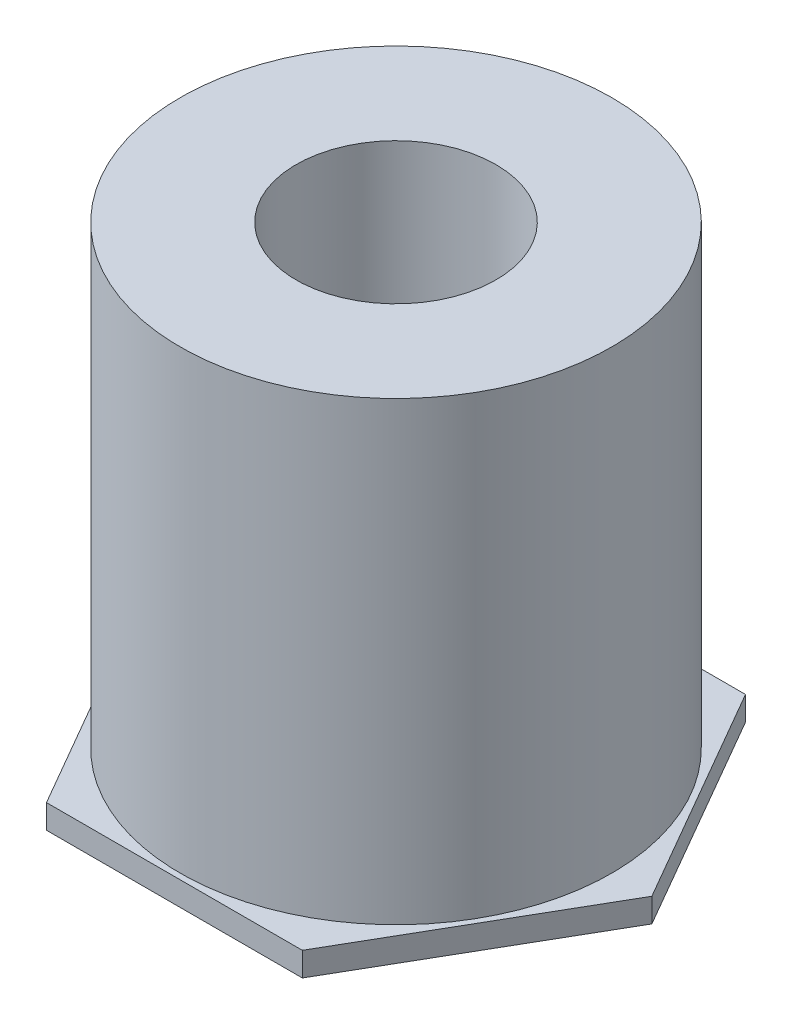
ISO-10303-21;
HEADER;
FILE_DESCRIPTION(('STEP AP214'),'2;1');
FILE_NAME('part.step','',(''),(''),'','','');
FILE_SCHEMA(('AUTOMOTIVE_DESIGN { 1 0 10303 214 1 1 1 1 }'));
ENDSEC;
DATA;
#1=APPLICATION_CONTEXT('core data for automotive mechanical design processes');
#2=APPLICATION_PROTOCOL_DEFINITION('international standard','automotive_design',2000,#1);
#3=PRODUCT_CONTEXT('',#1,'mechanical');
#4=PRODUCT('Part','Part','',(#3));
#5=PRODUCT_RELATED_PRODUCT_CATEGORY('part','',(#4));
#6=PRODUCT_DEFINITION_FORMATION('','',#4);
#7=PRODUCT_DEFINITION_CONTEXT('part definition',#1,'design');
#8=PRODUCT_DEFINITION('design','',#6,#7);
#9=PRODUCT_DEFINITION_SHAPE('','',#8);
#10=(LENGTH_UNIT() NAMED_UNIT(*) SI_UNIT(.MILLI.,.METRE.));
#11=(NAMED_UNIT(*) PLANE_ANGLE_UNIT() SI_UNIT($,.RADIAN.));
#12=(NAMED_UNIT(*) SI_UNIT($,.STERADIAN.) SOLID_ANGLE_UNIT());
#13=UNCERTAINTY_MEASURE_WITH_UNIT(LENGTH_MEASURE(1.E-05),#10,'distance_accuracy_value','');
#14=(GEOMETRIC_REPRESENTATION_CONTEXT(3) GLOBAL_UNCERTAINTY_ASSIGNED_CONTEXT((#13)) GLOBAL_UNIT_ASSIGNED_CONTEXT((#10,
#11,#12)) REPRESENTATION_CONTEXT('',''));
#15=CARTESIAN_POINT('',(0.,0.,0.));
#16=DIRECTION('',(0.,0.,1.));
#17=DIRECTION('',(1.,0.,0.));
#18=AXIS2_PLACEMENT_3D('',#15,#16,#17);
#19=CARTESIAN_POINT('',(22.,-2.,-43.5));
#20=DIRECTION('',(0.,-1.,0.));
#21=DIRECTION('',(0.,0.,-1.));
#22=AXIS2_PLACEMENT_3D('',#19,#20,#21);
#23=CYLINDRICAL_SURFACE('',#22,2.70000000000001);
#24=CARTESIAN_POINT('',(22.,-7.69999999999982,-43.5));
#25=DIRECTION('',(0.,-1.,0.));
#26=DIRECTION('',(0.,0.,-1.));
#27=AXIS2_PLACEMENT_3D('',#24,#25,#26);
#28=CIRCLE('',#27,2.70000000000001);
#29=CARTESIAN_POINT('',(22.,-7.69999999999982,-46.2));
#30=VERTEX_POINT('',#29);
#31=EDGE_CURVE('P0_E21',#30,#30,#28,.F.);
#32=ORIENTED_EDGE('',*,*,#31,.T.);
#33=EDGE_LOOP('',(#32));
#34=FACE_BOUND('',#33,.T.);
#35=CARTESIAN_POINT('',(22.,-2.,-43.5));
#36=DIRECTION('',(0.,-1.,0.));
#37=DIRECTION('',(0.,0.,-1.));
#38=AXIS2_PLACEMENT_3D('',#35,#36,#37);
#39=CIRCLE('',#38,2.70000000000001);
#40=CARTESIAN_POINT('',(22.,-2.,-46.2));
#41=VERTEX_POINT('',#40);
#42=EDGE_CURVE('P0_E83',#41,#41,#39,.T.);
#43=ORIENTED_EDGE('',*,*,#42,.T.);
#44=EDGE_LOOP('',(#43));
#45=FACE_BOUND('',#44,.T.);
#46=ADVANCED_FACE('P0_F17',(#34,#45),#23,.T.);
#47=CARTESIAN_POINT('',(25.328,-7.7,-46.38213254379));
#48=DIRECTION('',(0.,-1.,0.));
#49=DIRECTION('',(0.,0.,1.));
#50=AXIS2_PLACEMENT_3D('',#47,#48,#49);
#51=PLANE('',#50);
#52=ORIENTED_EDGE('',*,*,#31,.F.);
#53=EDGE_LOOP('',(#52));
#54=FACE_BOUND('',#53,.T.);
#55=DIRECTION('',(0.500000000000601,0.,0.866025403784092));
#56=VECTOR('',#55,1.);
#57=CARTESIAN_POINT('',(19.6,-7.70000000000009,-42.114359353945));
#58=LINE('',#57,#56);
#59=CARTESIAN_POINT('',(18.8000000001443,-7.70000000000005,-43.49999999975));
#60=VERTEX_POINT('',#59);
#61=CARTESIAN_POINT('',(20.4,-7.70000000000005,-40.7287187078929));
#62=VERTEX_POINT('',#61);
#63=EDGE_CURVE('P0_E96',#60,#62,#58,.T.);
#64=ORIENTED_EDGE('',*,*,#63,.T.);
#65=DIRECTION('',(1.,0.,0.));
#66=VECTOR('',#65,1.);
#67=CARTESIAN_POINT('',(22.,-7.70000000000009,-40.72871870789));
#68=LINE('',#67,#66);
#69=CARTESIAN_POINT('',(23.6,-7.70000000000005,-40.7287187078929));
#70=VERTEX_POINT('',#69);
#71=EDGE_CURVE('P0_E99',#62,#70,#68,.T.);
#72=ORIENTED_EDGE('',*,*,#71,.T.);
#73=DIRECTION('',(0.500000000000604,0.,-0.86602540378409));
#74=VECTOR('',#73,1.);
#75=CARTESIAN_POINT('',(24.4,-7.70000000000009,-42.114359353945));
#76=LINE('',#75,#74);
#77=CARTESIAN_POINT('',(25.1999999998557,-7.70000000000005,-43.50000000025));
#78=VERTEX_POINT('',#77);
#79=EDGE_CURVE('P0_E102',#70,#78,#76,.T.);
#80=ORIENTED_EDGE('',*,*,#79,.T.);
#81=DIRECTION('',(-0.500000000000601,0.,-0.866025403784092));
#82=VECTOR('',#81,1.);
#83=CARTESIAN_POINT('',(24.4,-7.70000000000009,-44.885640646055));
#84=LINE('',#83,#82);
#85=CARTESIAN_POINT('',(23.6,-7.70000000000005,-46.2712812921071));
#86=VERTEX_POINT('',#85);
#87=EDGE_CURVE('P0_E82',#78,#86,#84,.T.);
#88=ORIENTED_EDGE('',*,*,#87,.T.);
#89=DIRECTION('',(-1.,0.,0.));
#90=VECTOR('',#89,1.);
#91=CARTESIAN_POINT('',(22.,-7.70000000000009,-46.27128129211));
#92=LINE('',#91,#90);
#93=CARTESIAN_POINT('',(20.4,-7.70000000000007,-46.2712812921083));
#94=VERTEX_POINT('',#93);
#95=EDGE_CURVE('P0_E77',#86,#94,#92,.T.);
#96=ORIENTED_EDGE('',*,*,#95,.T.);
#97=DIRECTION('',(-0.500000000000599,0.,0.866025403784093));
#98=VECTOR('',#97,1.);
#99=CARTESIAN_POINT('',(19.6,-7.70000000000009,-44.885640646055));
#100=LINE('',#99,#98);
#101=EDGE_CURVE('P0_E80',#94,#60,#100,.T.);
#102=ORIENTED_EDGE('',*,*,#101,.T.);
#103=EDGE_LOOP('',(#64,#72,#80,#88,#96,#102));
#104=FACE_BOUND('',#103,.T.);
#105=ADVANCED_FACE('P0_F78',(#54,#104),#51,.F.);
#106=CARTESIAN_POINT('',(24.80993409406,-2.,-46.308));
#107=DIRECTION('',(0.,-1.,0.));
#108=DIRECTION('',(0.,0.,1.));
#109=AXIS2_PLACEMENT_3D('',#106,#107,#108);
#110=PLANE('',#109);
#111=CARTESIAN_POINT('',(22.,-2.,-43.5));
#112=DIRECTION('',(0.,-1.,0.));
#113=DIRECTION('',(0.,0.,-1.));
#114=AXIS2_PLACEMENT_3D('',#111,#112,#113);
#115=CIRCLE('',#114,1.25);
#116=CARTESIAN_POINT('',(22.,-2.,-44.75));
#117=VERTEX_POINT('',#116);
#118=EDGE_CURVE('P0_E93',#117,#117,#115,.F.);
#119=ORIENTED_EDGE('',*,*,#118,.F.);
#120=EDGE_LOOP('',(#119));
#121=FACE_BOUND('',#120,.T.);
#122=ORIENTED_EDGE('',*,*,#42,.F.);
#123=EDGE_LOOP('',(#122));
#124=FACE_BOUND('',#123,.T.);
#125=ADVANCED_FACE('P0_F132',(#121,#124),#110,.F.);
#126=CARTESIAN_POINT('',(23.664,-7.686969082918,-46.27128129211));
#127=DIRECTION('',(0.,0.,1.));
#128=DIRECTION('',(-1.,0.,0.));
#129=AXIS2_PLACEMENT_3D('',#126,#127,#128);
#130=PLANE('',#129);
#131=ORIENTED_EDGE('',*,*,#95,.F.);
#132=DIRECTION('',(0.,-1.,0.));
#133=VECTOR('',#132,1.);
#134=CARTESIAN_POINT('',(23.6,-7.85,-46.2712812921079));
#135=LINE('',#134,#133);
#136=CARTESIAN_POINT('',(23.5999999999997,-8.,-46.2712812921064));
#137=VERTEX_POINT('',#136);
#138=EDGE_CURVE('P0_E51',#86,#137,#135,.T.);
#139=ORIENTED_EDGE('',*,*,#138,.T.);
#140=DIRECTION('',(1.,0.,0.));
#141=VECTOR('',#140,1.);
#142=CARTESIAN_POINT('',(22.,-8.,-46.2712812921052));
#143=LINE('',#142,#141);
#144=CARTESIAN_POINT('',(20.4000000000003,-8.,-46.2712812921064));
#145=VERTEX_POINT('',#144);
#146=EDGE_CURVE('P0_E57',#145,#137,#143,.T.);
#147=ORIENTED_EDGE('',*,*,#146,.F.);
#148=DIRECTION('',(0.,1.,0.));
#149=VECTOR('',#148,1.);
#150=CARTESIAN_POINT('',(20.4,-7.85,-46.2712812921079));
#151=LINE('',#150,#149);
#152=EDGE_CURVE('P0_E85',#145,#94,#151,.T.);
#153=ORIENTED_EDGE('',*,*,#152,.T.);
#154=EDGE_LOOP('',(#131,#139,#147,#153));
#155=FACE_BOUND('',#154,.T.);
#156=ADVANCED_FACE('P0_F86',(#155),#130,.F.);
#157=CARTESIAN_POINT('',(25.232,-7.686969082918,-43.44457437416));
#158=DIRECTION('',(-0.866025403784092,0.,0.5000000000006));
#159=DIRECTION('',(-0.5000000000006,0.,-0.866025403784092));
#160=AXIS2_PLACEMENT_3D('',#157,#158,#159);
#161=PLANE('',#160);
#162=ORIENTED_EDGE('',*,*,#87,.F.);
#163=DIRECTION('',(0.,-1.,0.));
#164=VECTOR('',#163,1.);
#165=CARTESIAN_POINT('',(25.2,-7.85,-43.4999999999979));
#166=LINE('',#165,#164);
#167=CARTESIAN_POINT('',(25.2000000000002,-8.,-43.4999999999991));
#168=VERTEX_POINT('',#167);
#169=EDGE_CURVE('P0_E101',#78,#168,#166,.T.);
#170=ORIENTED_EDGE('',*,*,#169,.T.);
#171=DIRECTION('',(0.500000000000678,0.,0.866025403784047));
#172=VECTOR('',#171,1.);
#173=CARTESIAN_POINT('',(23.6,-8.,-46.2712812921052));
#174=LINE('',#173,#172);
#175=EDGE_CURVE('P0_E111',#137,#168,#174,.T.);
#176=ORIENTED_EDGE('',*,*,#175,.F.);
#177=ORIENTED_EDGE('',*,*,#138,.F.);
#178=EDGE_LOOP('',(#162,#170,#176,#177));
#179=FACE_BOUND('',#178,.T.);
#180=ADVANCED_FACE('P0_F165',(#179),#161,.F.);
#181=CARTESIAN_POINT('',(23.568,-7.686969082918,-40.67329308205));
#182=DIRECTION('',(-0.866025403784091,0.,-0.500000000000602));
#183=DIRECTION('',(0.500000000000602,0.,-0.866025403784091));
#184=AXIS2_PLACEMENT_3D('',#181,#182,#183);
#185=PLANE('',#184);
#186=ORIENTED_EDGE('',*,*,#79,.F.);
#187=DIRECTION('',(0.,-1.,0.));
#188=VECTOR('',#187,1.);
#189=CARTESIAN_POINT('',(23.6,-7.85,-40.72871870789));
#190=LINE('',#189,#188);
#191=CARTESIAN_POINT('',(23.5999999999995,-8.,-40.7287187078927));
#192=VERTEX_POINT('',#191);
#193=EDGE_CURVE('P0_E98',#70,#192,#190,.T.);
#194=ORIENTED_EDGE('',*,*,#193,.T.);
#195=DIRECTION('',(-0.500000000000679,0.,0.866025403784047));
#196=VECTOR('',#195,1.);
#197=CARTESIAN_POINT('',(25.2,-8.,-43.5));
#198=LINE('',#197,#196);
#199=EDGE_CURVE('P0_E109',#168,#192,#198,.T.);
#200=ORIENTED_EDGE('',*,*,#199,.F.);
#201=ORIENTED_EDGE('',*,*,#169,.F.);
#202=EDGE_LOOP('',(#186,#194,#200,#201));
#203=FACE_BOUND('',#202,.T.);
#204=ADVANCED_FACE('P0_F162',(#203),#185,.F.);
#205=CARTESIAN_POINT('',(20.336,-7.686969082918,-40.72871870789));
#206=DIRECTION('',(0.,0.,-1.));
#207=DIRECTION('',(1.,0.,0.));
#208=AXIS2_PLACEMENT_3D('',#205,#206,#207);
#209=PLANE('',#208);
#210=ORIENTED_EDGE('',*,*,#71,.F.);
#211=DIRECTION('',(0.,-1.,0.));
#212=VECTOR('',#211,1.);
#213=CARTESIAN_POINT('',(20.4,-7.85,-40.7287187078921));
#214=LINE('',#213,#212);
#215=CARTESIAN_POINT('',(20.4000000000003,-8.,-40.7287187078936));
#216=VERTEX_POINT('',#215);
#217=EDGE_CURVE('P0_E89',#62,#216,#214,.T.);
#218=ORIENTED_EDGE('',*,*,#217,.T.);
#219=DIRECTION('',(-1.,0.,0.));
#220=VECTOR('',#219,1.);
#221=CARTESIAN_POINT('',(22.,-8.,-40.7287187078948));
#222=LINE('',#221,#220);
#223=EDGE_CURVE('P0_E106',#192,#216,#222,.T.);
#224=ORIENTED_EDGE('',*,*,#223,.F.);
#225=ORIENTED_EDGE('',*,*,#193,.F.);
#226=EDGE_LOOP('',(#210,#218,#224,#225));
#227=FACE_BOUND('',#226,.T.);
#228=ADVANCED_FACE('P0_F157',(#227),#209,.F.);
#229=CARTESIAN_POINT('',(18.768,-7.686969082918,-43.55542562584));
#230=DIRECTION('',(0.866025403784091,0.,-0.500000000000601));
#231=DIRECTION('',(0.500000000000601,0.,0.866025403784091));
#232=AXIS2_PLACEMENT_3D('',#229,#230,#231);
#233=PLANE('',#232);
#234=ORIENTED_EDGE('',*,*,#63,.F.);
#235=DIRECTION('',(0.,-1.,0.));
#236=VECTOR('',#235,1.);
#237=CARTESIAN_POINT('',(18.8,-7.85,-43.5000000000021));
#238=LINE('',#237,#236);
#239=CARTESIAN_POINT('',(18.8000000000002,-8.,-43.5000000000009));
#240=VERTEX_POINT('',#239);
#241=EDGE_CURVE('P0_E36',#60,#240,#238,.T.);
#242=ORIENTED_EDGE('',*,*,#241,.T.);
#243=DIRECTION('',(-0.500000000000679,0.,-0.866025403784047));
#244=VECTOR('',#243,1.);
#245=CARTESIAN_POINT('',(20.4,-8.,-40.7287187078948));
#246=LINE('',#245,#244);
#247=EDGE_CURVE('P0_E108',#216,#240,#246,.T.);
#248=ORIENTED_EDGE('',*,*,#247,.F.);
#249=ORIENTED_EDGE('',*,*,#217,.F.);
#250=EDGE_LOOP('',(#234,#242,#248,#249));
#251=FACE_BOUND('',#250,.T.);
#252=ADVANCED_FACE('P0_F154',(#251),#233,.F.);
#253=CARTESIAN_POINT('',(20.432,-7.686969082918,-46.32670691795));
#254=DIRECTION('',(0.866025403784092,0.,0.500000000000599));
#255=DIRECTION('',(-0.500000000000599,0.,0.866025403784092));
#256=AXIS2_PLACEMENT_3D('',#253,#254,#255);
#257=PLANE('',#256);
#258=ORIENTED_EDGE('',*,*,#101,.F.);
#259=ORIENTED_EDGE('',*,*,#152,.F.);
#260=DIRECTION('',(0.500000000000678,0.,-0.866025403784047));
#261=VECTOR('',#260,1.);
#262=CARTESIAN_POINT('',(18.8,-8.,-43.5));
#263=LINE('',#262,#261);
#264=EDGE_CURVE('P0_E27',#240,#145,#263,.T.);
#265=ORIENTED_EDGE('',*,*,#264,.F.);
#266=ORIENTED_EDGE('',*,*,#241,.F.);
#267=EDGE_LOOP('',(#258,#259,#265,#266));
#268=FACE_BOUND('',#267,.T.);
#269=ADVANCED_FACE('P0_F91',(#268),#257,.F.);
#270=CARTESIAN_POINT('',(22.,-2.,-43.5));
#271=DIRECTION('',(0.,-1.,0.));
#272=DIRECTION('',(0.,0.,-1.));
#273=AXIS2_PLACEMENT_3D('',#270,#271,#272);
#274=CYLINDRICAL_SURFACE('',#273,1.25);
#275=ORIENTED_EDGE('',*,*,#118,.T.);
#276=EDGE_LOOP('',(#275));
#277=FACE_BOUND('',#276,.T.);
#278=CARTESIAN_POINT('',(22.,-7.99999999999981,-43.5));
#279=DIRECTION('',(0.,-1.,0.));
#280=DIRECTION('',(0.,0.,-1.));
#281=AXIS2_PLACEMENT_3D('',#278,#279,#280);
#282=CIRCLE('',#281,1.25);
#283=CARTESIAN_POINT('',(22.,-7.99999999999981,-44.75));
#284=VERTEX_POINT('',#283);
#285=EDGE_CURVE('P0_E11',#284,#284,#282,.F.);
#286=ORIENTED_EDGE('',*,*,#285,.F.);
#287=EDGE_LOOP('',(#286));
#288=FACE_BOUND('',#287,.T.);
#289=ADVANCED_FACE('P0_F143',(#277,#288),#274,.F.);
#290=CARTESIAN_POINT('',(25.328,-8.,-46.38213254379));
#291=DIRECTION('',(0.,-1.,0.));
#292=DIRECTION('',(0.,0.,1.));
#293=AXIS2_PLACEMENT_3D('',#290,#291,#292);
#294=PLANE('',#293);
#295=ORIENTED_EDGE('',*,*,#285,.T.);
#296=EDGE_LOOP('',(#295));
#297=FACE_BOUND('',#296,.T.);
#298=ORIENTED_EDGE('',*,*,#247,.T.);
#299=ORIENTED_EDGE('',*,*,#264,.T.);
#300=ORIENTED_EDGE('',*,*,#146,.T.);
#301=ORIENTED_EDGE('',*,*,#175,.T.);
#302=ORIENTED_EDGE('',*,*,#199,.T.);
#303=ORIENTED_EDGE('',*,*,#223,.T.);
#304=EDGE_LOOP('',(#298,#299,#300,#301,#302,#303));
#305=FACE_BOUND('',#304,.T.);
#306=ADVANCED_FACE('P0_F19',(#297,#305),#294,.T.);
#307=CLOSED_SHELL('',(#46,#105,#125,#156,#180,#204,#228,#252,#269,#289,#306));
#308=MANIFOLD_SOLID_BREP('P0_B1',#307);
#309=CARTESIAN_POINT('',(22.,-2.,-43.5));
#310=DIRECTION('',(0.,-1.,0.));
#311=DIRECTION('',(0.,0.,-1.));
#312=AXIS2_PLACEMENT_3D('',#309,#310,#311);
#313=CYLINDRICAL_SURFACE('',#312,1.5);
#314=CARTESIAN_POINT('',(22.,-2.,-43.5));
#315=DIRECTION('',(0.,-1.,0.));
#316=DIRECTION('',(0.,0.,1.));
#317=AXIS2_PLACEMENT_3D('',#314,#315,#316);
#318=CIRCLE('',#317,1.5);
#319=CARTESIAN_POINT('',(22.,-2.,-42.));
#320=VERTEX_POINT('',#319);
#321=EDGE_CURVE('P1_E10',#320,#320,#318,.F.);
#322=ORIENTED_EDGE('',*,*,#321,.T.);
#323=EDGE_LOOP('',(#322));
#324=FACE_BOUND('',#323,.T.);
#325=CARTESIAN_POINT('',(22.,-7.99999999999981,-43.5));
#326=DIRECTION('',(0.,-1.,0.));
#327=DIRECTION('',(0.,0.,1.));
#328=AXIS2_PLACEMENT_3D('',#325,#326,#327);
#329=CIRCLE('',#328,1.5);
#330=CARTESIAN_POINT('',(22.,-7.99999999999981,-42.));
#331=VERTEX_POINT('',#330);
#332=EDGE_CURVE('P1_E16',#331,#331,#329,.T.);
#333=ORIENTED_EDGE('',*,*,#332,.T.);
#334=EDGE_LOOP('',(#333));
#335=FACE_BOUND('',#334,.T.);
#336=ADVANCED_FACE('P1_F15',(#324,#335),#313,.F.);
#337=OPEN_SHELL('',(#336));
#338=SHELL_BASED_SURFACE_MODEL('P1_B1',(#337));
#339=ADVANCED_BREP_SHAPE_REPRESENTATION('',(#18,#308),#14);
#340=MANIFOLD_SURFACE_SHAPE_REPRESENTATION('',(#18,#338),#14);
#341=SHAPE_REPRESENTATION('',(#18),#14);
#342=SHAPE_DEFINITION_REPRESENTATION(#9,#341);
#343=SHAPE_REPRESENTATION_RELATIONSHIP('','',#341,#339);
#344=SHAPE_REPRESENTATION_RELATIONSHIP('','',#341,#340);
ENDSEC;
END-ISO-10303-21;
